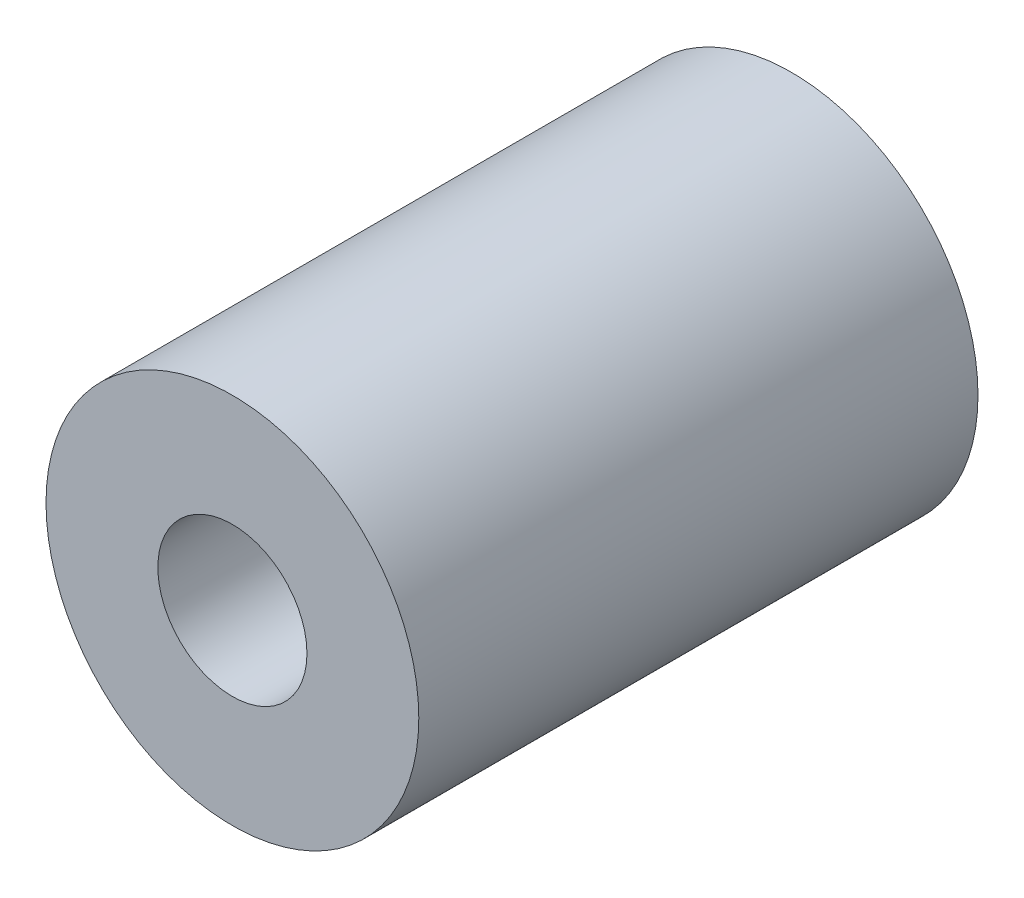
ISO-10303-21;
HEADER;
FILE_DESCRIPTION(('STEP AP214'),'2;1');
FILE_NAME('part.step','',(''),(''),'','','');
FILE_SCHEMA(('AUTOMOTIVE_DESIGN { 1 0 10303 214 1 1 1 1 }'));
ENDSEC;
DATA;
#1=APPLICATION_CONTEXT('core data for automotive mechanical design processes');
#2=APPLICATION_PROTOCOL_DEFINITION('international standard','automotive_design',2000,#1);
#3=PRODUCT_CONTEXT('',#1,'mechanical');
#4=PRODUCT('Part','Part','',(#3));
#5=PRODUCT_RELATED_PRODUCT_CATEGORY('part','',(#4));
#6=PRODUCT_DEFINITION_FORMATION('','',#4);
#7=PRODUCT_DEFINITION_CONTEXT('part definition',#1,'design');
#8=PRODUCT_DEFINITION('design','',#6,#7);
#9=PRODUCT_DEFINITION_SHAPE('','',#8);
#10=(LENGTH_UNIT() NAMED_UNIT(*) SI_UNIT(.MILLI.,.METRE.));
#11=(NAMED_UNIT(*) PLANE_ANGLE_UNIT() SI_UNIT($,.RADIAN.));
#12=(NAMED_UNIT(*) SI_UNIT($,.STERADIAN.) SOLID_ANGLE_UNIT());
#13=UNCERTAINTY_MEASURE_WITH_UNIT(LENGTH_MEASURE(1.E-05),#10,'distance_accuracy_value','');
#14=(GEOMETRIC_REPRESENTATION_CONTEXT(3) GLOBAL_UNCERTAINTY_ASSIGNED_CONTEXT((#13)) GLOBAL_UNIT_ASSIGNED_CONTEXT((#10,
#11,#12)) REPRESENTATION_CONTEXT('',''));
#15=CARTESIAN_POINT('',(0.,0.,0.));
#16=DIRECTION('',(0.,0.,1.));
#17=DIRECTION('',(1.,0.,0.));
#18=AXIS2_PLACEMENT_3D('',#15,#16,#17);
#19=CARTESIAN_POINT('',(0.,0.,0.));
#20=DIRECTION('',(0.,0.,1.));
#21=DIRECTION('',(1.,0.,0.));
#22=AXIS2_PLACEMENT_3D('',#19,#20,#21);
#23=CYLINDRICAL_SURFACE('',#22,4.);
#24=CARTESIAN_POINT('',(0.,0.,30.));
#25=DIRECTION('',(0.,0.,1.));
#26=DIRECTION('',(1.,0.,0.));
#27=AXIS2_PLACEMENT_3D('',#24,#25,#26);
#28=CIRCLE('',#27,4.);
#29=CARTESIAN_POINT('',(4.,0.,30.));
#30=VERTEX_POINT('',#29);
#31=EDGE_CURVE('E52',#30,#30,#28,.T.);
#32=ORIENTED_EDGE('',*,*,#31,.T.);
#33=EDGE_LOOP('',(#32));
#34=FACE_BOUND('',#33,.T.);
#35=CARTESIAN_POINT('',(0.,0.,15.));
#36=DIRECTION('',(0.,0.,-1.));
#37=DIRECTION('',(-1.,0.,0.));
#38=AXIS2_PLACEMENT_3D('',#35,#36,#37);
#39=CIRCLE('',#38,4.);
#40=CARTESIAN_POINT('',(-4.,0.,15.));
#41=VERTEX_POINT('',#40);
#42=EDGE_CURVE('E41',#41,#41,#39,.F.);
#43=ORIENTED_EDGE('',*,*,#42,.F.);
#44=EDGE_LOOP('',(#43));
#45=FACE_BOUND('',#44,.T.);
#46=ADVANCED_FACE('F37',(#34,#45),#23,.F.);
#47=CARTESIAN_POINT('',(0.,0.,30.));
#48=DIRECTION('',(0.,0.,1.));
#49=DIRECTION('',(1.,0.,0.));
#50=AXIS2_PLACEMENT_3D('',#47,#48,#49);
#51=PLANE('',#50);
#52=ORIENTED_EDGE('',*,*,#31,.F.);
#53=EDGE_LOOP('',(#52));
#54=FACE_BOUND('',#53,.T.);
#55=CARTESIAN_POINT('',(0.,0.,30.));
#56=DIRECTION('',(0.,0.,1.));
#57=DIRECTION('',(1.,0.,0.));
#58=AXIS2_PLACEMENT_3D('',#55,#56,#57);
#59=CIRCLE('',#58,10.);
#60=CARTESIAN_POINT('',(10.,0.,30.));
#61=VERTEX_POINT('',#60);
#62=EDGE_CURVE('E10',#61,#61,#59,.T.);
#63=ORIENTED_EDGE('',*,*,#62,.T.);
#64=EDGE_LOOP('',(#63));
#65=FACE_BOUND('',#64,.T.);
#66=ADVANCED_FACE('F73',(#54,#65),#51,.T.);
#67=CARTESIAN_POINT('',(0.,0.,0.));
#68=DIRECTION('',(0.,0.,1.));
#69=DIRECTION('',(1.,0.,0.));
#70=AXIS2_PLACEMENT_3D('',#67,#68,#69);
#71=PLANE('',#70);
#72=CARTESIAN_POINT('',(0.,0.,0.));
#73=DIRECTION('',(0.,0.,-1.));
#74=DIRECTION('',(-1.,0.,0.));
#75=AXIS2_PLACEMENT_3D('',#72,#73,#74);
#76=CIRCLE('',#75,5.);
#77=CARTESIAN_POINT('',(-5.,0.,0.));
#78=VERTEX_POINT('',#77);
#79=EDGE_CURVE('E57',#78,#78,#76,.T.);
#80=ORIENTED_EDGE('',*,*,#79,.F.);
#81=EDGE_LOOP('',(#80));
#82=FACE_BOUND('',#81,.T.);
#83=CARTESIAN_POINT('',(0.,0.,0.));
#84=DIRECTION('',(0.,0.,1.));
#85=DIRECTION('',(1.,0.,0.));
#86=AXIS2_PLACEMENT_3D('',#83,#84,#85);
#87=CIRCLE('',#86,10.);
#88=CARTESIAN_POINT('',(10.,0.,0.));
#89=VERTEX_POINT('',#88);
#90=EDGE_CURVE('E46',#89,#89,#87,.T.);
#91=ORIENTED_EDGE('',*,*,#90,.F.);
#92=EDGE_LOOP('',(#91));
#93=FACE_BOUND('',#92,.T.);
#94=ADVANCED_FACE('F79',(#82,#93),#71,.F.);
#95=CARTESIAN_POINT('',(0.,0.,30.));
#96=DIRECTION('',(0.,0.,-1.));
#97=DIRECTION('',(-1.,0.,0.));
#98=AXIS2_PLACEMENT_3D('',#95,#96,#97);
#99=CYLINDRICAL_SURFACE('',#98,10.);
#100=ORIENTED_EDGE('',*,*,#62,.F.);
#101=EDGE_LOOP('',(#100));
#102=FACE_BOUND('',#101,.T.);
#103=ORIENTED_EDGE('',*,*,#90,.T.);
#104=EDGE_LOOP('',(#103));
#105=FACE_BOUND('',#104,.T.);
#106=ADVANCED_FACE('F39',(#102,#105),#99,.T.);
#107=CARTESIAN_POINT('',(0.,0.,15.));
#108=DIRECTION('',(0.,0.,-1.));
#109=DIRECTION('',(-1.,0.,0.));
#110=AXIS2_PLACEMENT_3D('',#107,#108,#109);
#111=PLANE('',#110);
#112=CARTESIAN_POINT('',(0.,0.,15.));
#113=DIRECTION('',(0.,0.,-1.));
#114=DIRECTION('',(-1.,0.,0.));
#115=AXIS2_PLACEMENT_3D('',#112,#113,#114);
#116=CIRCLE('',#115,5.);
#117=CARTESIAN_POINT('',(-5.,0.,15.));
#118=VERTEX_POINT('',#117);
#119=EDGE_CURVE('E61',#118,#118,#116,.T.);
#120=ORIENTED_EDGE('',*,*,#119,.T.);
#121=EDGE_LOOP('',(#120));
#122=FACE_BOUND('',#121,.T.);
#123=ORIENTED_EDGE('',*,*,#42,.T.);
#124=EDGE_LOOP('',(#123));
#125=FACE_BOUND('',#124,.T.);
#126=ADVANCED_FACE('F70',(#122,#125),#111,.T.);
#127=CARTESIAN_POINT('',(0.,0.,15.));
#128=DIRECTION('',(0.,0.,-1.));
#129=DIRECTION('',(-1.,0.,0.));
#130=AXIS2_PLACEMENT_3D('',#127,#128,#129);
#131=CYLINDRICAL_SURFACE('',#130,5.);
#132=ORIENTED_EDGE('',*,*,#119,.F.);
#133=EDGE_LOOP('',(#132));
#134=FACE_BOUND('',#133,.T.);
#135=ORIENTED_EDGE('',*,*,#79,.T.);
#136=EDGE_LOOP('',(#135));
#137=FACE_BOUND('',#136,.T.);
#138=ADVANCED_FACE('F83',(#134,#137),#131,.F.);
#139=CLOSED_SHELL('',(#46,#66,#94,#106,#126,#138));
#140=MANIFOLD_SOLID_BREP('B2',#139);
#141=ADVANCED_BREP_SHAPE_REPRESENTATION('',(#18,#140),#14);
#142=SHAPE_DEFINITION_REPRESENTATION(#9,#141);
ENDSEC;
END-ISO-10303-21;
